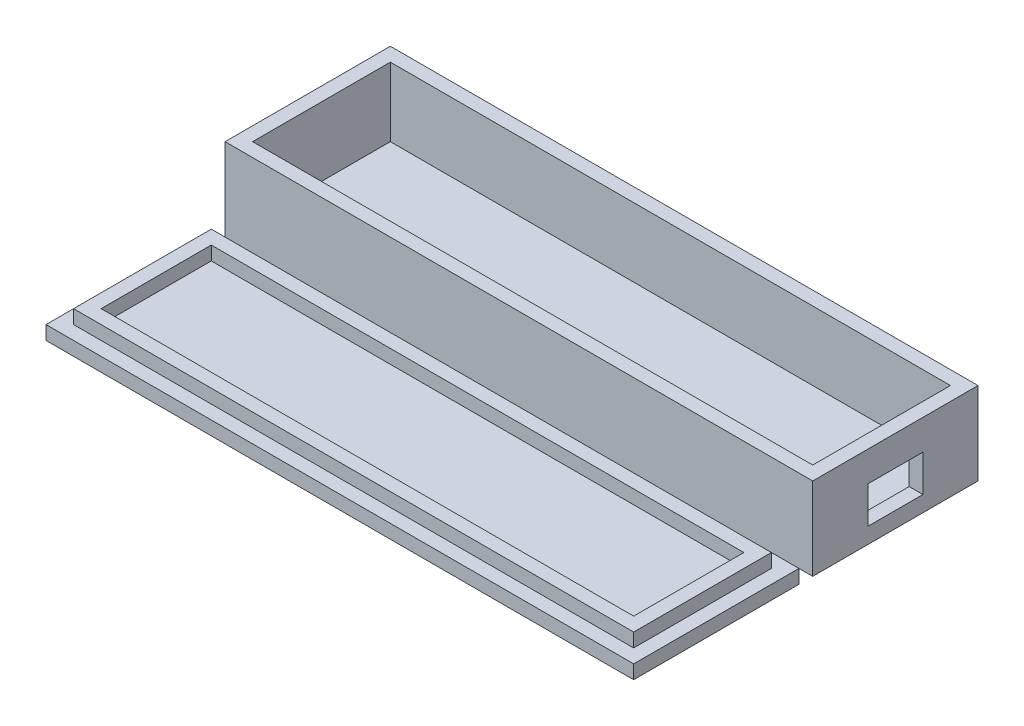
ISO-10303-21;
HEADER;
FILE_DESCRIPTION(('STEP AP214'),'2;1');
FILE_NAME('part.step','',(''),(''),'','','');
FILE_SCHEMA(('AUTOMOTIVE_DESIGN { 1 0 10303 214 1 1 1 1 }'));
ENDSEC;
DATA;
#1=APPLICATION_CONTEXT('core data for automotive mechanical design processes');
#2=APPLICATION_PROTOCOL_DEFINITION('international standard','automotive_design',2000,#1);
#3=PRODUCT_CONTEXT('',#1,'mechanical');
#4=PRODUCT('Part','Part','',(#3));
#5=PRODUCT_RELATED_PRODUCT_CATEGORY('part','',(#4));
#6=PRODUCT_DEFINITION_FORMATION('','',#4);
#7=PRODUCT_DEFINITION_CONTEXT('part definition',#1,'design');
#8=PRODUCT_DEFINITION('design','',#6,#7);
#9=PRODUCT_DEFINITION_SHAPE('','',#8);
#10=(LENGTH_UNIT() NAMED_UNIT(*) SI_UNIT(.MILLI.,.METRE.));
#11=(NAMED_UNIT(*) PLANE_ANGLE_UNIT() SI_UNIT($,.RADIAN.));
#12=(NAMED_UNIT(*) SI_UNIT($,.STERADIAN.) SOLID_ANGLE_UNIT());
#13=UNCERTAINTY_MEASURE_WITH_UNIT(LENGTH_MEASURE(1.E-05),#10,'distance_accuracy_value','');
#14=(GEOMETRIC_REPRESENTATION_CONTEXT(3) GLOBAL_UNCERTAINTY_ASSIGNED_CONTEXT((#13)) GLOBAL_UNIT_ASSIGNED_CONTEXT((#10,
#11,#12)) REPRESENTATION_CONTEXT('',''));
#15=CARTESIAN_POINT('',(0.,0.,0.));
#16=DIRECTION('',(0.,0.,1.));
#17=DIRECTION('',(1.,0.,0.));
#18=AXIS2_PLACEMENT_3D('',#15,#16,#17);
#19=CARTESIAN_POINT('',(0.,3.,0.));
#20=DIRECTION('',(0.,-1.,0.));
#21=DIRECTION('',(0.,0.,-1.));
#22=AXIS2_PLACEMENT_3D('',#19,#20,#21);
#23=PLANE('',#22);
#24=DIRECTION('',(0.,0.,-1.));
#25=VECTOR('',#24,1.);
#26=CARTESIAN_POINT('',(64.,3.,57.));
#27=LINE('',#26,#25);
#28=CARTESIAN_POINT('',(64.,3.,57.));
#29=VERTEX_POINT('',#28);
#30=CARTESIAN_POINT('',(64.,3.,21.));
#31=VERTEX_POINT('',#30);
#32=EDGE_CURVE('E167',#29,#31,#27,.T.);
#33=ORIENTED_EDGE('',*,*,#32,.T.);
#34=DIRECTION('',(-1.,0.,0.));
#35=VECTOR('',#34,1.);
#36=CARTESIAN_POINT('',(-64.,3.,21.));
#37=LINE('',#36,#35);
#38=CARTESIAN_POINT('',(-64.,3.,21.));
#39=VERTEX_POINT('',#38);
#40=EDGE_CURVE('E170',#31,#39,#37,.T.);
#41=ORIENTED_EDGE('',*,*,#40,.T.);
#42=DIRECTION('',(0.,0.,1.));
#43=VECTOR('',#42,1.);
#44=CARTESIAN_POINT('',(-64.,3.,57.));
#45=LINE('',#44,#43);
#46=CARTESIAN_POINT('',(-64.,3.,57.));
#47=VERTEX_POINT('',#46);
#48=EDGE_CURVE('E173',#39,#47,#45,.T.);
#49=ORIENTED_EDGE('',*,*,#48,.T.);
#50=DIRECTION('',(1.,0.,0.));
#51=VECTOR('',#50,1.);
#52=CARTESIAN_POINT('',(-64.,3.,57.));
#53=LINE('',#52,#51);
#54=EDGE_CURVE('E175',#47,#29,#53,.T.);
#55=ORIENTED_EDGE('',*,*,#54,.T.);
#56=EDGE_LOOP('',(#33,#41,#49,#55));
#57=FACE_BOUND('',#56,.T.);
#58=DIRECTION('',(1.,0.,0.));
#59=VECTOR('',#58,1.);
#60=CARTESIAN_POINT('',(0.,3.,54.));
#61=LINE('',#60,#59);
#62=CARTESIAN_POINT('',(-61.,3.,54.));
#63=VERTEX_POINT('',#62);
#64=CARTESIAN_POINT('',(61.,3.,54.));
#65=VERTEX_POINT('',#64);
#66=EDGE_CURVE('E157',#63,#65,#61,.T.);
#67=ORIENTED_EDGE('',*,*,#66,.F.);
#68=DIRECTION('',(0.,0.,-1.));
#69=VECTOR('',#68,1.);
#70=CARTESIAN_POINT('',(-61.,3.,0.));
#71=LINE('',#70,#69);
#72=CARTESIAN_POINT('',(-61.,3.,24.));
#73=VERTEX_POINT('',#72);
#74=EDGE_CURVE('E244',#63,#73,#71,.T.);
#75=ORIENTED_EDGE('',*,*,#74,.T.);
#76=DIRECTION('',(1.,0.,0.));
#77=VECTOR('',#76,1.);
#78=CARTESIAN_POINT('',(0.,3.,24.));
#79=LINE('',#78,#77);
#80=CARTESIAN_POINT('',(61.,3.,24.));
#81=VERTEX_POINT('',#80);
#82=EDGE_CURVE('E58',#73,#81,#79,.T.);
#83=ORIENTED_EDGE('',*,*,#82,.T.);
#84=DIRECTION('',(0.,0.,-1.));
#85=VECTOR('',#84,1.);
#86=CARTESIAN_POINT('',(61.,3.,0.));
#87=LINE('',#86,#85);
#88=EDGE_CURVE('E259',#65,#81,#87,.T.);
#89=ORIENTED_EDGE('',*,*,#88,.F.);
#90=EDGE_LOOP('',(#67,#75,#83,#89));
#91=FACE_BOUND('',#90,.T.);
#92=ADVANCED_FACE('F43',(#57,#91),#23,.F.);
#93=CARTESIAN_POINT('',(64.,3.,57.));
#94=DIRECTION('',(-1.,0.,0.));
#95=DIRECTION('',(0.,0.,1.));
#96=AXIS2_PLACEMENT_3D('',#93,#94,#95);
#97=PLANE('',#96);
#98=DIRECTION('',(0.,0.,-1.));
#99=VECTOR('',#98,1.);
#100=CARTESIAN_POINT('',(64.,0.,57.));
#101=LINE('',#100,#99);
#102=CARTESIAN_POINT('',(64.,0.,57.));
#103=VERTEX_POINT('',#102);
#104=CARTESIAN_POINT('',(64.,0.,21.));
#105=VERTEX_POINT('',#104);
#106=EDGE_CURVE('E178',#103,#105,#101,.T.);
#107=ORIENTED_EDGE('',*,*,#106,.T.);
#108=DIRECTION('',(0.,-1.,0.));
#109=VECTOR('',#108,1.);
#110=CARTESIAN_POINT('',(64.,3.,21.));
#111=LINE('',#110,#109);
#112=EDGE_CURVE('E12',#31,#105,#111,.T.);
#113=ORIENTED_EDGE('',*,*,#112,.F.);
#114=ORIENTED_EDGE('',*,*,#32,.F.);
#115=DIRECTION('',(0.,-1.,0.));
#116=VECTOR('',#115,1.);
#117=CARTESIAN_POINT('',(64.,3.,57.));
#118=LINE('',#117,#116);
#119=EDGE_CURVE('E177',#29,#103,#118,.T.);
#120=ORIENTED_EDGE('',*,*,#119,.T.);
#121=EDGE_LOOP('',(#107,#113,#114,#120));
#122=FACE_BOUND('',#121,.T.);
#123=ADVANCED_FACE('F45',(#122),#97,.F.);
#124=CARTESIAN_POINT('',(-64.,3.,21.));
#125=DIRECTION('',(0.,0.,1.));
#126=DIRECTION('',(1.,0.,0.));
#127=AXIS2_PLACEMENT_3D('',#124,#125,#126);
#128=PLANE('',#127);
#129=DIRECTION('',(-1.,0.,0.));
#130=VECTOR('',#129,1.);
#131=CARTESIAN_POINT('',(-64.,0.,21.));
#132=LINE('',#131,#130);
#133=CARTESIAN_POINT('',(-64.,0.,21.));
#134=VERTEX_POINT('',#133);
#135=EDGE_CURVE('E181',#105,#134,#132,.T.);
#136=ORIENTED_EDGE('',*,*,#135,.T.);
#137=DIRECTION('',(0.,-1.,0.));
#138=VECTOR('',#137,1.);
#139=CARTESIAN_POINT('',(-64.,3.,21.));
#140=LINE('',#139,#138);
#141=EDGE_CURVE('E51',#39,#134,#140,.T.);
#142=ORIENTED_EDGE('',*,*,#141,.F.);
#143=ORIENTED_EDGE('',*,*,#40,.F.);
#144=ORIENTED_EDGE('',*,*,#112,.T.);
#145=EDGE_LOOP('',(#136,#142,#143,#144));
#146=FACE_BOUND('',#145,.T.);
#147=ADVANCED_FACE('F212',(#146),#128,.F.);
#148=CARTESIAN_POINT('',(-64.,3.,57.));
#149=DIRECTION('',(1.,0.,0.));
#150=DIRECTION('',(0.,0.,-1.));
#151=AXIS2_PLACEMENT_3D('',#148,#149,#150);
#152=PLANE('',#151);
#153=DIRECTION('',(0.,0.,1.));
#154=VECTOR('',#153,1.);
#155=CARTESIAN_POINT('',(-64.,0.,57.));
#156=LINE('',#155,#154);
#157=CARTESIAN_POINT('',(-64.,0.,57.));
#158=VERTEX_POINT('',#157);
#159=EDGE_CURVE('E184',#134,#158,#156,.T.);
#160=ORIENTED_EDGE('',*,*,#159,.T.);
#161=DIRECTION('',(0.,-1.,0.));
#162=VECTOR('',#161,1.);
#163=CARTESIAN_POINT('',(-64.,3.,57.));
#164=LINE('',#163,#162);
#165=EDGE_CURVE('E189',#47,#158,#164,.T.);
#166=ORIENTED_EDGE('',*,*,#165,.F.);
#167=ORIENTED_EDGE('',*,*,#48,.F.);
#168=ORIENTED_EDGE('',*,*,#141,.T.);
#169=EDGE_LOOP('',(#160,#166,#167,#168));
#170=FACE_BOUND('',#169,.T.);
#171=ADVANCED_FACE('F196',(#170),#152,.F.);
#172=CARTESIAN_POINT('',(-64.,3.,57.));
#173=DIRECTION('',(0.,0.,-1.));
#174=DIRECTION('',(-1.,0.,0.));
#175=AXIS2_PLACEMENT_3D('',#172,#173,#174);
#176=PLANE('',#175);
#177=DIRECTION('',(1.,0.,0.));
#178=VECTOR('',#177,1.);
#179=CARTESIAN_POINT('',(-64.,0.,57.));
#180=LINE('',#179,#178);
#181=EDGE_CURVE('E171',#158,#103,#180,.T.);
#182=ORIENTED_EDGE('',*,*,#181,.T.);
#183=ORIENTED_EDGE('',*,*,#119,.F.);
#184=ORIENTED_EDGE('',*,*,#54,.F.);
#185=ORIENTED_EDGE('',*,*,#165,.T.);
#186=EDGE_LOOP('',(#182,#183,#184,#185));
#187=FACE_BOUND('',#186,.T.);
#188=ADVANCED_FACE('F205',(#187),#176,.F.);
#189=CARTESIAN_POINT('',(0.,0.,0.));
#190=DIRECTION('',(0.,-1.,0.));
#191=DIRECTION('',(0.,0.,-1.));
#192=AXIS2_PLACEMENT_3D('',#189,#190,#191);
#193=PLANE('',#192);
#194=ORIENTED_EDGE('',*,*,#106,.F.);
#195=ORIENTED_EDGE('',*,*,#181,.F.);
#196=ORIENTED_EDGE('',*,*,#159,.F.);
#197=ORIENTED_EDGE('',*,*,#135,.F.);
#198=EDGE_LOOP('',(#194,#195,#196,#197));
#199=FACE_BOUND('',#198,.T.);
#200=ADVANCED_FACE('F202',(#199),#193,.T.);
#201=CARTESIAN_POINT('',(0.,6.,51.));
#202=DIRECTION('',(0.,0.,-1.));
#203=DIRECTION('',(-1.,0.,0.));
#204=AXIS2_PLACEMENT_3D('',#201,#202,#203);
#205=PLANE('',#204);
#206=DIRECTION('',(1.,0.,0.));
#207=VECTOR('',#206,1.);
#208=CARTESIAN_POINT('',(0.,3.,51.));
#209=LINE('',#208,#207);
#210=CARTESIAN_POINT('',(-58.,3.,51.));
#211=VERTEX_POINT('',#210);
#212=CARTESIAN_POINT('',(58.,3.,51.));
#213=VERTEX_POINT('',#212);
#214=EDGE_CURVE('E239',#211,#213,#209,.T.);
#215=ORIENTED_EDGE('',*,*,#214,.F.);
#216=DIRECTION('',(0.,-1.,0.));
#217=VECTOR('',#216,1.);
#218=CARTESIAN_POINT('',(-58.,6.,51.));
#219=LINE('',#218,#217);
#220=CARTESIAN_POINT('',(-58.,6.,51.));
#221=VERTEX_POINT('',#220);
#222=EDGE_CURVE('E182',#221,#211,#219,.T.);
#223=ORIENTED_EDGE('',*,*,#222,.F.);
#224=DIRECTION('',(1.,0.,0.));
#225=VECTOR('',#224,1.);
#226=CARTESIAN_POINT('',(0.,6.,51.));
#227=LINE('',#226,#225);
#228=CARTESIAN_POINT('',(58.,6.,51.));
#229=VERTEX_POINT('',#228);
#230=EDGE_CURVE('E271',#221,#229,#227,.T.);
#231=ORIENTED_EDGE('',*,*,#230,.T.);
#232=DIRECTION('',(0.,-1.,0.));
#233=VECTOR('',#232,1.);
#234=CARTESIAN_POINT('',(58.,6.,51.));
#235=LINE('',#234,#233);
#236=EDGE_CURVE('E159',#229,#213,#235,.T.);
#237=ORIENTED_EDGE('',*,*,#236,.T.);
#238=EDGE_LOOP('',(#215,#223,#231,#237));
#239=FACE_BOUND('',#238,.T.);
#240=ADVANCED_FACE('F295',(#239),#205,.T.);
#241=CARTESIAN_POINT('',(-58.,6.,0.));
#242=DIRECTION('',(-1.,0.,0.));
#243=DIRECTION('',(0.,0.,1.));
#244=AXIS2_PLACEMENT_3D('',#241,#242,#243);
#245=PLANE('',#244);
#246=DIRECTION('',(0.,0.,-1.));
#247=VECTOR('',#246,1.);
#248=CARTESIAN_POINT('',(-58.,3.,0.));
#249=LINE('',#248,#247);
#250=CARTESIAN_POINT('',(-58.,3.,27.));
#251=VERTEX_POINT('',#250);
#252=EDGE_CURVE('E236',#211,#251,#249,.T.);
#253=ORIENTED_EDGE('',*,*,#252,.T.);
#254=DIRECTION('',(0.,-1.,0.));
#255=VECTOR('',#254,1.);
#256=CARTESIAN_POINT('',(-58.,6.,27.));
#257=LINE('',#256,#255);
#258=CARTESIAN_POINT('',(-58.,6.,27.));
#259=VERTEX_POINT('',#258);
#260=EDGE_CURVE('E250',#259,#251,#257,.T.);
#261=ORIENTED_EDGE('',*,*,#260,.F.);
#262=DIRECTION('',(0.,0.,-1.));
#263=VECTOR('',#262,1.);
#264=CARTESIAN_POINT('',(-58.,6.,0.));
#265=LINE('',#264,#263);
#266=EDGE_CURVE('E268',#221,#259,#265,.T.);
#267=ORIENTED_EDGE('',*,*,#266,.F.);
#268=ORIENTED_EDGE('',*,*,#222,.T.);
#269=EDGE_LOOP('',(#253,#261,#267,#268));
#270=FACE_BOUND('',#269,.T.);
#271=ADVANCED_FACE('F290',(#270),#245,.F.);
#272=CARTESIAN_POINT('',(0.,6.,27.));
#273=DIRECTION('',(0.,0.,-1.));
#274=DIRECTION('',(-1.,0.,0.));
#275=AXIS2_PLACEMENT_3D('',#272,#273,#274);
#276=PLANE('',#275);
#277=DIRECTION('',(1.,0.,0.));
#278=VECTOR('',#277,1.);
#279=CARTESIAN_POINT('',(0.,3.,27.));
#280=LINE('',#279,#278);
#281=CARTESIAN_POINT('',(58.,3.,27.));
#282=VERTEX_POINT('',#281);
#283=EDGE_CURVE('E66',#251,#282,#280,.T.);
#284=ORIENTED_EDGE('',*,*,#283,.T.);
#285=DIRECTION('',(0.,-1.,0.));
#286=VECTOR('',#285,1.);
#287=CARTESIAN_POINT('',(58.,6.,27.));
#288=LINE('',#287,#286);
#289=CARTESIAN_POINT('',(58.,6.,27.));
#290=VERTEX_POINT('',#289);
#291=EDGE_CURVE('E161',#290,#282,#288,.T.);
#292=ORIENTED_EDGE('',*,*,#291,.F.);
#293=DIRECTION('',(1.,0.,0.));
#294=VECTOR('',#293,1.);
#295=CARTESIAN_POINT('',(0.,6.,27.));
#296=LINE('',#295,#294);
#297=EDGE_CURVE('E266',#259,#290,#296,.T.);
#298=ORIENTED_EDGE('',*,*,#297,.F.);
#299=ORIENTED_EDGE('',*,*,#260,.T.);
#300=EDGE_LOOP('',(#284,#292,#298,#299));
#301=FACE_BOUND('',#300,.T.);
#302=ADVANCED_FACE('F286',(#301),#276,.F.);
#303=CARTESIAN_POINT('',(0.,6.,54.));
#304=DIRECTION('',(0.,0.,-1.));
#305=DIRECTION('',(-1.,0.,0.));
#306=AXIS2_PLACEMENT_3D('',#303,#304,#305);
#307=PLANE('',#306);
#308=ORIENTED_EDGE('',*,*,#66,.T.);
#309=DIRECTION('',(0.,-1.,0.));
#310=VECTOR('',#309,1.);
#311=CARTESIAN_POINT('',(61.,6.,54.));
#312=LINE('',#311,#310);
#313=CARTESIAN_POINT('',(61.,6.,54.));
#314=VERTEX_POINT('',#313);
#315=EDGE_CURVE('E137',#314,#65,#312,.T.);
#316=ORIENTED_EDGE('',*,*,#315,.F.);
#317=DIRECTION('',(1.,0.,0.));
#318=VECTOR('',#317,1.);
#319=CARTESIAN_POINT('',(0.,6.,54.));
#320=LINE('',#319,#318);
#321=CARTESIAN_POINT('',(-61.,6.,54.));
#322=VERTEX_POINT('',#321);
#323=EDGE_CURVE('E144',#322,#314,#320,.T.);
#324=ORIENTED_EDGE('',*,*,#323,.F.);
#325=DIRECTION('',(0.,-1.,0.));
#326=VECTOR('',#325,1.);
#327=CARTESIAN_POINT('',(-61.,6.,54.));
#328=LINE('',#327,#326);
#329=EDGE_CURVE('E253',#322,#63,#328,.T.);
#330=ORIENTED_EDGE('',*,*,#329,.T.);
#331=EDGE_LOOP('',(#308,#316,#324,#330));
#332=FACE_BOUND('',#331,.T.);
#333=ADVANCED_FACE('F155',(#332),#307,.F.);
#334=CARTESIAN_POINT('',(61.,6.,0.));
#335=DIRECTION('',(-1.,0.,0.));
#336=DIRECTION('',(0.,0.,1.));
#337=AXIS2_PLACEMENT_3D('',#334,#335,#336);
#338=PLANE('',#337);
#339=ORIENTED_EDGE('',*,*,#88,.T.);
#340=DIRECTION('',(0.,-1.,0.));
#341=VECTOR('',#340,1.);
#342=CARTESIAN_POINT('',(61.,6.,24.));
#343=LINE('',#342,#341);
#344=CARTESIAN_POINT('',(61.,6.,24.));
#345=VERTEX_POINT('',#344);
#346=EDGE_CURVE('E139',#345,#81,#343,.T.);
#347=ORIENTED_EDGE('',*,*,#346,.F.);
#348=DIRECTION('',(0.,0.,-1.));
#349=VECTOR('',#348,1.);
#350=CARTESIAN_POINT('',(61.,6.,0.));
#351=LINE('',#350,#349);
#352=EDGE_CURVE('E132',#314,#345,#351,.T.);
#353=ORIENTED_EDGE('',*,*,#352,.F.);
#354=ORIENTED_EDGE('',*,*,#315,.T.);
#355=EDGE_LOOP('',(#339,#347,#353,#354));
#356=FACE_BOUND('',#355,.T.);
#357=ADVANCED_FACE('F135',(#356),#338,.F.);
#358=CARTESIAN_POINT('',(0.,6.,24.));
#359=DIRECTION('',(0.,0.,-1.));
#360=DIRECTION('',(-1.,0.,0.));
#361=AXIS2_PLACEMENT_3D('',#358,#359,#360);
#362=PLANE('',#361);
#363=ORIENTED_EDGE('',*,*,#82,.F.);
#364=DIRECTION('',(0.,-1.,0.));
#365=VECTOR('',#364,1.);
#366=CARTESIAN_POINT('',(-61.,6.,24.));
#367=LINE('',#366,#365);
#368=CARTESIAN_POINT('',(-61.,6.,24.));
#369=VERTEX_POINT('',#368);
#370=EDGE_CURVE('E163',#369,#73,#367,.T.);
#371=ORIENTED_EDGE('',*,*,#370,.F.);
#372=DIRECTION('',(1.,0.,0.));
#373=VECTOR('',#372,1.);
#374=CARTESIAN_POINT('',(0.,6.,24.));
#375=LINE('',#374,#373);
#376=EDGE_CURVE('E143',#369,#345,#375,.T.);
#377=ORIENTED_EDGE('',*,*,#376,.T.);
#378=ORIENTED_EDGE('',*,*,#346,.T.);
#379=EDGE_LOOP('',(#363,#371,#377,#378));
#380=FACE_BOUND('',#379,.T.);
#381=ADVANCED_FACE('F275',(#380),#362,.T.);
#382=CARTESIAN_POINT('',(-61.,6.,0.));
#383=DIRECTION('',(-1.,0.,0.));
#384=DIRECTION('',(0.,0.,1.));
#385=AXIS2_PLACEMENT_3D('',#382,#383,#384);
#386=PLANE('',#385);
#387=ORIENTED_EDGE('',*,*,#74,.F.);
#388=ORIENTED_EDGE('',*,*,#329,.F.);
#389=DIRECTION('',(0.,0.,-1.));
#390=VECTOR('',#389,1.);
#391=CARTESIAN_POINT('',(-61.,6.,0.));
#392=LINE('',#391,#390);
#393=EDGE_CURVE('E151',#322,#369,#392,.T.);
#394=ORIENTED_EDGE('',*,*,#393,.T.);
#395=ORIENTED_EDGE('',*,*,#370,.T.);
#396=EDGE_LOOP('',(#387,#388,#394,#395));
#397=FACE_BOUND('',#396,.T.);
#398=ADVANCED_FACE('F258',(#397),#386,.T.);
#399=CARTESIAN_POINT('',(58.,6.,0.));
#400=DIRECTION('',(-1.,0.,0.));
#401=DIRECTION('',(0.,0.,1.));
#402=AXIS2_PLACEMENT_3D('',#399,#400,#401);
#403=PLANE('',#402);
#404=DIRECTION('',(0.,0.,-1.));
#405=VECTOR('',#404,1.);
#406=CARTESIAN_POINT('',(58.,3.,0.));
#407=LINE('',#406,#405);
#408=EDGE_CURVE('E153',#213,#282,#407,.T.);
#409=ORIENTED_EDGE('',*,*,#408,.F.);
#410=ORIENTED_EDGE('',*,*,#236,.F.);
#411=DIRECTION('',(0.,0.,-1.));
#412=VECTOR('',#411,1.);
#413=CARTESIAN_POINT('',(58.,6.,0.));
#414=LINE('',#413,#412);
#415=EDGE_CURVE('E254',#229,#290,#414,.T.);
#416=ORIENTED_EDGE('',*,*,#415,.T.);
#417=ORIENTED_EDGE('',*,*,#291,.T.);
#418=EDGE_LOOP('',(#409,#410,#416,#417));
#419=FACE_BOUND('',#418,.T.);
#420=ADVANCED_FACE('F231',(#419),#403,.T.);
#421=CARTESIAN_POINT('',(0.,6.,0.));
#422=DIRECTION('',(0.,1.,0.));
#423=DIRECTION('',(0.,0.,1.));
#424=AXIS2_PLACEMENT_3D('',#421,#422,#423);
#425=PLANE('',#424);
#426=ORIENTED_EDGE('',*,*,#323,.T.);
#427=ORIENTED_EDGE('',*,*,#352,.T.);
#428=ORIENTED_EDGE('',*,*,#376,.F.);
#429=ORIENTED_EDGE('',*,*,#393,.F.);
#430=EDGE_LOOP('',(#426,#427,#428,#429));
#431=FACE_BOUND('',#430,.T.);
#432=ORIENTED_EDGE('',*,*,#230,.F.);
#433=ORIENTED_EDGE('',*,*,#266,.T.);
#434=ORIENTED_EDGE('',*,*,#297,.T.);
#435=ORIENTED_EDGE('',*,*,#415,.F.);
#436=EDGE_LOOP('',(#432,#433,#434,#435));
#437=FACE_BOUND('',#436,.T.);
#438=ADVANCED_FACE('F148',(#431,#437),#425,.T.);
#439=ORIENTED_EDGE('',*,*,#252,.F.);
#440=ORIENTED_EDGE('',*,*,#214,.T.);
#441=ORIENTED_EDGE('',*,*,#408,.T.);
#442=ORIENTED_EDGE('',*,*,#283,.F.);
#443=EDGE_LOOP('',(#439,#440,#441,#442));
#444=FACE_BOUND('',#443,.T.);
#445=ADVANCED_FACE('F221',(#444),#23,.F.);
#446=CLOSED_SHELL('',(#92,#123,#147,#171,#188,#200,#240,#271,#302,#333,#357,#381,#398,#420,#438,#445));
#447=MANIFOLD_SOLID_BREP('B2',#446);
#448=CARTESIAN_POINT('',(64.,3.,18.));
#449=DIRECTION('',(-1.,0.,0.));
#450=DIRECTION('',(0.,0.,1.));
#451=AXIS2_PLACEMENT_3D('',#448,#449,#450);
#452=PLANE('',#451);
#453=DIRECTION('',(0.,0.,1.));
#454=VECTOR('',#453,1.);
#455=CARTESIAN_POINT('',(64.,11.4383547284987,6.));
#456=LINE('',#455,#454);
#457=CARTESIAN_POINT('',(64.,11.4383547284987,-6.));
#458=VERTEX_POINT('',#457);
#459=CARTESIAN_POINT('',(64.,11.4383547284987,6.));
#460=VERTEX_POINT('',#459);
#461=EDGE_CURVE('E495',#458,#460,#456,.T.);
#462=ORIENTED_EDGE('',*,*,#461,.F.);
#463=DIRECTION('',(0.,1.,0.));
#464=VECTOR('',#463,1.);
#465=CARTESIAN_POINT('',(64.,3.43835472849873,-6.));
#466=LINE('',#465,#464);
#467=CARTESIAN_POINT('',(64.,3.43835472849873,-6.));
#468=VERTEX_POINT('',#467);
#469=EDGE_CURVE('E410',#468,#458,#466,.T.);
#470=ORIENTED_EDGE('',*,*,#469,.F.);
#471=DIRECTION('',(0.,0.,-1.));
#472=VECTOR('',#471,1.);
#473=CARTESIAN_POINT('',(64.,3.43835472849873,6.));
#474=LINE('',#473,#472);
#475=CARTESIAN_POINT('',(64.,3.43835472849873,6.));
#476=VERTEX_POINT('',#475);
#477=EDGE_CURVE('E501',#476,#468,#474,.T.);
#478=ORIENTED_EDGE('',*,*,#477,.F.);
#479=DIRECTION('',(0.,-1.,0.));
#480=VECTOR('',#479,1.);
#481=CARTESIAN_POINT('',(64.,3.43835472849873,6.));
#482=LINE('',#481,#480);
#483=EDGE_CURVE('E486',#460,#476,#482,.T.);
#484=ORIENTED_EDGE('',*,*,#483,.F.);
#485=EDGE_LOOP('',(#462,#470,#478,#484));
#486=FACE_BOUND('',#485,.T.);
#487=DIRECTION('',(0.,0.,-1.));
#488=VECTOR('',#487,1.);
#489=CARTESIAN_POINT('',(64.,0.,18.));
#490=LINE('',#489,#488);
#491=CARTESIAN_POINT('',(64.,0.,18.));
#492=VERTEX_POINT('',#491);
#493=CARTESIAN_POINT('',(64.,0.,-18.));
#494=VERTEX_POINT('',#493);
#495=EDGE_CURVE('E552',#492,#494,#490,.T.);
#496=ORIENTED_EDGE('',*,*,#495,.T.);
#497=DIRECTION('',(0.,-1.,0.));
#498=VECTOR('',#497,1.);
#499=CARTESIAN_POINT('',(64.,3.,-18.));
#500=LINE('',#499,#498);
#501=CARTESIAN_POINT('',(64.,18.,-18.));
#502=VERTEX_POINT('',#501);
#503=EDGE_CURVE('E570',#502,#494,#500,.T.);
#504=ORIENTED_EDGE('',*,*,#503,.F.);
#505=DIRECTION('',(0.,0.,-1.));
#506=VECTOR('',#505,1.);
#507=CARTESIAN_POINT('',(64.,18.,18.));
#508=LINE('',#507,#506);
#509=CARTESIAN_POINT('',(64.,18.,18.));
#510=VERTEX_POINT('',#509);
#511=EDGE_CURVE('E540',#510,#502,#508,.T.);
#512=ORIENTED_EDGE('',*,*,#511,.F.);
#513=DIRECTION('',(0.,-1.,0.));
#514=VECTOR('',#513,1.);
#515=CARTESIAN_POINT('',(64.,3.,18.));
#516=LINE('',#515,#514);
#517=EDGE_CURVE('E561',#510,#492,#516,.T.);
#518=ORIENTED_EDGE('',*,*,#517,.T.);
#519=EDGE_LOOP('',(#496,#504,#512,#518));
#520=FACE_BOUND('',#519,.T.);
#521=ADVANCED_FACE('F396',(#486,#520),#452,.F.);
#522=CARTESIAN_POINT('',(-64.,3.,-18.));
#523=DIRECTION('',(0.,0.,1.));
#524=DIRECTION('',(1.,0.,0.));
#525=AXIS2_PLACEMENT_3D('',#522,#523,#524);
#526=PLANE('',#525);
#527=DIRECTION('',(-1.,0.,0.));
#528=VECTOR('',#527,1.);
#529=CARTESIAN_POINT('',(-64.,0.,-18.));
#530=LINE('',#529,#528);
#531=CARTESIAN_POINT('',(-64.,0.,-18.));
#532=VERTEX_POINT('',#531);
#533=EDGE_CURVE('E555',#494,#532,#530,.T.);
#534=ORIENTED_EDGE('',*,*,#533,.T.);
#535=DIRECTION('',(0.,-1.,0.));
#536=VECTOR('',#535,1.);
#537=CARTESIAN_POINT('',(-64.,3.,-18.));
#538=LINE('',#537,#536);
#539=CARTESIAN_POINT('',(-64.,18.,-18.));
#540=VERTEX_POINT('',#539);
#541=EDGE_CURVE('E567',#540,#532,#538,.T.);
#542=ORIENTED_EDGE('',*,*,#541,.F.);
#543=DIRECTION('',(-1.,0.,0.));
#544=VECTOR('',#543,1.);
#545=CARTESIAN_POINT('',(-64.,18.,-18.));
#546=LINE('',#545,#544);
#547=EDGE_CURVE('E543',#502,#540,#546,.T.);
#548=ORIENTED_EDGE('',*,*,#547,.F.);
#549=ORIENTED_EDGE('',*,*,#503,.T.);
#550=EDGE_LOOP('',(#534,#542,#548,#549));
#551=FACE_BOUND('',#550,.T.);
#552=ADVANCED_FACE('F598',(#551),#526,.F.);
#553=CARTESIAN_POINT('',(-64.,3.,18.));
#554=DIRECTION('',(1.,0.,0.));
#555=DIRECTION('',(0.,0.,-1.));
#556=AXIS2_PLACEMENT_3D('',#553,#554,#555);
#557=PLANE('',#556);
#558=DIRECTION('',(0.,0.,1.));
#559=VECTOR('',#558,1.);
#560=CARTESIAN_POINT('',(-64.,0.,18.));
#561=LINE('',#560,#559);
#562=CARTESIAN_POINT('',(-64.,0.,18.));
#563=VERTEX_POINT('',#562);
#564=EDGE_CURVE('E557',#532,#563,#561,.T.);
#565=ORIENTED_EDGE('',*,*,#564,.T.);
#566=DIRECTION('',(0.,-1.,0.));
#567=VECTOR('',#566,1.);
#568=CARTESIAN_POINT('',(-64.,3.,18.));
#569=LINE('',#568,#567);
#570=CARTESIAN_POINT('',(-64.,18.,18.));
#571=VERTEX_POINT('',#570);
#572=EDGE_CURVE('E564',#571,#563,#569,.T.);
#573=ORIENTED_EDGE('',*,*,#572,.F.);
#574=DIRECTION('',(0.,0.,1.));
#575=VECTOR('',#574,1.);
#576=CARTESIAN_POINT('',(-64.,18.,18.));
#577=LINE('',#576,#575);
#578=EDGE_CURVE('E546',#540,#571,#577,.T.);
#579=ORIENTED_EDGE('',*,*,#578,.F.);
#580=ORIENTED_EDGE('',*,*,#541,.T.);
#581=EDGE_LOOP('',(#565,#573,#579,#580));
#582=FACE_BOUND('',#581,.T.);
#583=ADVANCED_FACE('F602',(#582),#557,.F.);
#584=CARTESIAN_POINT('',(-64.,3.,18.));
#585=DIRECTION('',(0.,0.,-1.));
#586=DIRECTION('',(-1.,0.,0.));
#587=AXIS2_PLACEMENT_3D('',#584,#585,#586);
#588=PLANE('',#587);
#589=DIRECTION('',(1.,0.,0.));
#590=VECTOR('',#589,1.);
#591=CARTESIAN_POINT('',(-64.,0.,18.));
#592=LINE('',#591,#590);
#593=EDGE_CURVE('E559',#563,#492,#592,.T.);
#594=ORIENTED_EDGE('',*,*,#593,.T.);
#595=ORIENTED_EDGE('',*,*,#517,.F.);
#596=DIRECTION('',(1.,0.,0.));
#597=VECTOR('',#596,1.);
#598=CARTESIAN_POINT('',(-64.,18.,18.));
#599=LINE('',#598,#597);
#600=EDGE_CURVE('E549',#571,#510,#599,.T.);
#601=ORIENTED_EDGE('',*,*,#600,.F.);
#602=ORIENTED_EDGE('',*,*,#572,.T.);
#603=EDGE_LOOP('',(#594,#595,#601,#602));
#604=FACE_BOUND('',#603,.T.);
#605=ADVANCED_FACE('F607',(#604),#588,.F.);
#606=CARTESIAN_POINT('',(0.,0.,0.));
#607=DIRECTION('',(0.,-1.,0.));
#608=DIRECTION('',(0.,0.,-1.));
#609=AXIS2_PLACEMENT_3D('',#606,#607,#608);
#610=PLANE('',#609);
#611=ORIENTED_EDGE('',*,*,#495,.F.);
#612=ORIENTED_EDGE('',*,*,#593,.F.);
#613=ORIENTED_EDGE('',*,*,#564,.F.);
#614=ORIENTED_EDGE('',*,*,#533,.F.);
#615=EDGE_LOOP('',(#611,#612,#613,#614));
#616=FACE_BOUND('',#615,.T.);
#617=ADVANCED_FACE('F613',(#616),#610,.T.);
#618=CARTESIAN_POINT('',(0.,18.,0.));
#619=DIRECTION('',(0.,-1.,0.));
#620=DIRECTION('',(0.,0.,-1.));
#621=AXIS2_PLACEMENT_3D('',#618,#619,#620);
#622=PLANE('',#621);
#623=ORIENTED_EDGE('',*,*,#511,.T.);
#624=ORIENTED_EDGE('',*,*,#547,.T.);
#625=ORIENTED_EDGE('',*,*,#578,.T.);
#626=ORIENTED_EDGE('',*,*,#600,.T.);
#627=EDGE_LOOP('',(#623,#624,#625,#626));
#628=FACE_BOUND('',#627,.T.);
#629=DIRECTION('',(0.,0.,-1.));
#630=VECTOR('',#629,1.);
#631=CARTESIAN_POINT('',(61.,18.,15.));
#632=LINE('',#631,#630);
#633=CARTESIAN_POINT('',(61.,18.,15.));
#634=VERTEX_POINT('',#633);
#635=CARTESIAN_POINT('',(61.,18.,-15.));
#636=VERTEX_POINT('',#635);
#637=EDGE_CURVE('E511',#634,#636,#632,.T.);
#638=ORIENTED_EDGE('',*,*,#637,.F.);
#639=DIRECTION('',(1.,0.,0.));
#640=VECTOR('',#639,1.);
#641=CARTESIAN_POINT('',(-61.,18.,15.));
#642=LINE('',#641,#640);
#643=CARTESIAN_POINT('',(-61.,18.,15.));
#644=VERTEX_POINT('',#643);
#645=EDGE_CURVE('E519',#644,#634,#642,.T.);
#646=ORIENTED_EDGE('',*,*,#645,.F.);
#647=DIRECTION('',(0.,0.,1.));
#648=VECTOR('',#647,1.);
#649=CARTESIAN_POINT('',(-61.,18.,15.));
#650=LINE('',#649,#648);
#651=CARTESIAN_POINT('',(-61.,18.,-15.));
#652=VERTEX_POINT('',#651);
#653=EDGE_CURVE('E516',#652,#644,#650,.T.);
#654=ORIENTED_EDGE('',*,*,#653,.F.);
#655=DIRECTION('',(-1.,0.,0.));
#656=VECTOR('',#655,1.);
#657=CARTESIAN_POINT('',(-61.,18.,-15.));
#658=LINE('',#657,#656);
#659=EDGE_CURVE('E513',#636,#652,#658,.T.);
#660=ORIENTED_EDGE('',*,*,#659,.F.);
#661=EDGE_LOOP('',(#638,#646,#654,#660));
#662=FACE_BOUND('',#661,.T.);
#663=ADVANCED_FACE('F616',(#628,#662),#622,.F.);
#664=CARTESIAN_POINT('',(61.,18.,15.));
#665=DIRECTION('',(-1.,0.,0.));
#666=DIRECTION('',(0.,0.,1.));
#667=AXIS2_PLACEMENT_3D('',#664,#665,#666);
#668=PLANE('',#667);
#669=DIRECTION('',(0.,-1.,0.));
#670=VECTOR('',#669,1.);
#671=CARTESIAN_POINT('',(61.,18.,-6.));
#672=LINE('',#671,#670);
#673=CARTESIAN_POINT('',(61.,11.4383547284987,-6.));
#674=VERTEX_POINT('',#673);
#675=CARTESIAN_POINT('',(61.,3.43835472849873,-6.));
#676=VERTEX_POINT('',#675);
#677=EDGE_CURVE('E41',#674,#676,#672,.T.);
#678=ORIENTED_EDGE('',*,*,#677,.F.);
#679=DIRECTION('',(0.,0.,-1.));
#680=VECTOR('',#679,1.);
#681=CARTESIAN_POINT('',(61.,11.4383547284987,15.));
#682=LINE('',#681,#680);
#683=CARTESIAN_POINT('',(61.,11.4383547284987,6.));
#684=VERTEX_POINT('',#683);
#685=EDGE_CURVE('E573',#684,#674,#682,.T.);
#686=ORIENTED_EDGE('',*,*,#685,.F.);
#687=DIRECTION('',(0.,1.,0.));
#688=VECTOR('',#687,1.);
#689=CARTESIAN_POINT('',(61.,18.,6.));
#690=LINE('',#689,#688);
#691=CARTESIAN_POINT('',(61.,3.43835472849873,6.));
#692=VERTEX_POINT('',#691);
#693=EDGE_CURVE('E489',#692,#684,#690,.T.);
#694=ORIENTED_EDGE('',*,*,#693,.F.);
#695=DIRECTION('',(0.,0.,1.));
#696=VECTOR('',#695,1.);
#697=CARTESIAN_POINT('',(61.,3.43835472849873,15.));
#698=LINE('',#697,#696);
#699=EDGE_CURVE('E403',#676,#692,#698,.T.);
#700=ORIENTED_EDGE('',*,*,#699,.F.);
#701=EDGE_LOOP('',(#678,#686,#694,#700));
#702=FACE_BOUND('',#701,.T.);
#703=DIRECTION('',(0.,0.,-1.));
#704=VECTOR('',#703,1.);
#705=CARTESIAN_POINT('',(61.,3.,15.));
#706=LINE('',#705,#704);
#707=CARTESIAN_POINT('',(61.,3.,15.));
#708=VERTEX_POINT('',#707);
#709=CARTESIAN_POINT('',(61.,3.,-15.));
#710=VERTEX_POINT('',#709);
#711=EDGE_CURVE('E508',#708,#710,#706,.T.);
#712=ORIENTED_EDGE('',*,*,#711,.F.);
#713=DIRECTION('',(0.,-1.,0.));
#714=VECTOR('',#713,1.);
#715=CARTESIAN_POINT('',(61.,18.,15.));
#716=LINE('',#715,#714);
#717=EDGE_CURVE('E521',#634,#708,#716,.T.);
#718=ORIENTED_EDGE('',*,*,#717,.F.);
#719=ORIENTED_EDGE('',*,*,#637,.T.);
#720=DIRECTION('',(0.,-1.,0.));
#721=VECTOR('',#720,1.);
#722=CARTESIAN_POINT('',(61.,18.,-15.));
#723=LINE('',#722,#721);
#724=EDGE_CURVE('E537',#636,#710,#723,.T.);
#725=ORIENTED_EDGE('',*,*,#724,.T.);
#726=EDGE_LOOP('',(#712,#718,#719,#725));
#727=FACE_BOUND('',#726,.T.);
#728=ADVANCED_FACE('F581',(#702,#727),#668,.T.);
#729=CARTESIAN_POINT('',(-61.,18.,-15.));
#730=DIRECTION('',(0.,0.,1.));
#731=DIRECTION('',(1.,0.,0.));
#732=AXIS2_PLACEMENT_3D('',#729,#730,#731);
#733=PLANE('',#732);
#734=DIRECTION('',(-1.,0.,0.));
#735=VECTOR('',#734,1.);
#736=CARTESIAN_POINT('',(-61.,3.,-15.));
#737=LINE('',#736,#735);
#738=CARTESIAN_POINT('',(-61.,3.,-15.));
#739=VERTEX_POINT('',#738);
#740=EDGE_CURVE('E524',#710,#739,#737,.T.);
#741=ORIENTED_EDGE('',*,*,#740,.F.);
#742=ORIENTED_EDGE('',*,*,#724,.F.);
#743=ORIENTED_EDGE('',*,*,#659,.T.);
#744=DIRECTION('',(0.,-1.,0.));
#745=VECTOR('',#744,1.);
#746=CARTESIAN_POINT('',(-61.,18.,-15.));
#747=LINE('',#746,#745);
#748=EDGE_CURVE('E535',#652,#739,#747,.T.);
#749=ORIENTED_EDGE('',*,*,#748,.T.);
#750=EDGE_LOOP('',(#741,#742,#743,#749));
#751=FACE_BOUND('',#750,.T.);
#752=ADVANCED_FACE('F624',(#751),#733,.T.);
#753=CARTESIAN_POINT('',(-61.,18.,15.));
#754=DIRECTION('',(1.,0.,0.));
#755=DIRECTION('',(0.,0.,-1.));
#756=AXIS2_PLACEMENT_3D('',#753,#754,#755);
#757=PLANE('',#756);
#758=DIRECTION('',(0.,0.,1.));
#759=VECTOR('',#758,1.);
#760=CARTESIAN_POINT('',(-61.,3.,15.));
#761=LINE('',#760,#759);
#762=CARTESIAN_POINT('',(-61.,3.,15.));
#763=VERTEX_POINT('',#762);
#764=EDGE_CURVE('E527',#739,#763,#761,.T.);
#765=ORIENTED_EDGE('',*,*,#764,.F.);
#766=ORIENTED_EDGE('',*,*,#748,.F.);
#767=ORIENTED_EDGE('',*,*,#653,.T.);
#768=DIRECTION('',(0.,-1.,0.));
#769=VECTOR('',#768,1.);
#770=CARTESIAN_POINT('',(-61.,18.,15.));
#771=LINE('',#770,#769);
#772=EDGE_CURVE('E533',#644,#763,#771,.T.);
#773=ORIENTED_EDGE('',*,*,#772,.T.);
#774=EDGE_LOOP('',(#765,#766,#767,#773));
#775=FACE_BOUND('',#774,.T.);
#776=ADVANCED_FACE('F627',(#775),#757,.T.);
#777=CARTESIAN_POINT('',(-61.,18.,15.));
#778=DIRECTION('',(0.,0.,-1.));
#779=DIRECTION('',(-1.,0.,0.));
#780=AXIS2_PLACEMENT_3D('',#777,#778,#779);
#781=PLANE('',#780);
#782=DIRECTION('',(1.,0.,0.));
#783=VECTOR('',#782,1.);
#784=CARTESIAN_POINT('',(-61.,3.,15.));
#785=LINE('',#784,#783);
#786=EDGE_CURVE('E514',#763,#708,#785,.T.);
#787=ORIENTED_EDGE('',*,*,#786,.F.);
#788=ORIENTED_EDGE('',*,*,#772,.F.);
#789=ORIENTED_EDGE('',*,*,#645,.T.);
#790=ORIENTED_EDGE('',*,*,#717,.T.);
#791=EDGE_LOOP('',(#787,#788,#789,#790));
#792=FACE_BOUND('',#791,.T.);
#793=ADVANCED_FACE('F592',(#792),#781,.T.);
#794=CARTESIAN_POINT('',(0.,3.,0.));
#795=DIRECTION('',(0.,-1.,0.));
#796=DIRECTION('',(0.,0.,-1.));
#797=AXIS2_PLACEMENT_3D('',#794,#795,#796);
#798=PLANE('',#797);
#799=ORIENTED_EDGE('',*,*,#786,.T.);
#800=ORIENTED_EDGE('',*,*,#711,.T.);
#801=ORIENTED_EDGE('',*,*,#740,.T.);
#802=ORIENTED_EDGE('',*,*,#764,.T.);
#803=EDGE_LOOP('',(#799,#800,#801,#802));
#804=FACE_BOUND('',#803,.T.);
#805=ADVANCED_FACE('F585',(#804),#798,.F.);
#806=CARTESIAN_POINT('',(52.,3.43835472849873,-6.));
#807=DIRECTION('',(0.,0.,-1.));
#808=DIRECTION('',(0.,1.,0.));
#809=AXIS2_PLACEMENT_3D('',#806,#807,#808);
#810=PLANE('',#809);
#811=ORIENTED_EDGE('',*,*,#677,.T.);
#812=DIRECTION('',(1.,0.,0.));
#813=VECTOR('',#812,1.);
#814=CARTESIAN_POINT('',(52.,3.43835472849873,-6.));
#815=LINE('',#814,#813);
#816=EDGE_CURVE('E506',#676,#468,#815,.T.);
#817=ORIENTED_EDGE('',*,*,#816,.T.);
#818=ORIENTED_EDGE('',*,*,#469,.T.);
#819=DIRECTION('',(1.,0.,0.));
#820=VECTOR('',#819,1.);
#821=CARTESIAN_POINT('',(52.,11.4383547284987,-6.));
#822=LINE('',#821,#820);
#823=EDGE_CURVE('E492',#674,#458,#822,.T.);
#824=ORIENTED_EDGE('',*,*,#823,.F.);
#825=EDGE_LOOP('',(#811,#817,#818,#824));
#826=FACE_BOUND('',#825,.T.);
#827=ADVANCED_FACE('F583',(#826),#810,.F.);
#828=CARTESIAN_POINT('',(52.,3.43835472849873,6.));
#829=DIRECTION('',(0.,-1.,0.));
#830=DIRECTION('',(0.,0.,-1.));
#831=AXIS2_PLACEMENT_3D('',#828,#829,#830);
#832=PLANE('',#831);
#833=ORIENTED_EDGE('',*,*,#699,.T.);
#834=DIRECTION('',(1.,0.,0.));
#835=VECTOR('',#834,1.);
#836=CARTESIAN_POINT('',(52.,3.43835472849873,6.));
#837=LINE('',#836,#835);
#838=EDGE_CURVE('E491',#692,#476,#837,.T.);
#839=ORIENTED_EDGE('',*,*,#838,.T.);
#840=ORIENTED_EDGE('',*,*,#477,.T.);
#841=ORIENTED_EDGE('',*,*,#816,.F.);
#842=EDGE_LOOP('',(#833,#839,#840,#841));
#843=FACE_BOUND('',#842,.T.);
#844=ADVANCED_FACE('F578',(#843),#832,.F.);
#845=CARTESIAN_POINT('',(52.,3.43835472849873,6.));
#846=DIRECTION('',(0.,0.,1.));
#847=DIRECTION('',(0.,-1.,0.));
#848=AXIS2_PLACEMENT_3D('',#845,#846,#847);
#849=PLANE('',#848);
#850=ORIENTED_EDGE('',*,*,#693,.T.);
#851=DIRECTION('',(1.,0.,0.));
#852=VECTOR('',#851,1.);
#853=CARTESIAN_POINT('',(52.,11.4383547284987,6.));
#854=LINE('',#853,#852);
#855=EDGE_CURVE('E418',#684,#460,#854,.T.);
#856=ORIENTED_EDGE('',*,*,#855,.T.);
#857=ORIENTED_EDGE('',*,*,#483,.T.);
#858=ORIENTED_EDGE('',*,*,#838,.F.);
#859=EDGE_LOOP('',(#850,#856,#857,#858));
#860=FACE_BOUND('',#859,.T.);
#861=ADVANCED_FACE('F483',(#860),#849,.F.);
#862=CARTESIAN_POINT('',(52.,11.4383547284987,6.));
#863=DIRECTION('',(0.,1.,0.));
#864=DIRECTION('',(0.,0.,1.));
#865=AXIS2_PLACEMENT_3D('',#862,#863,#864);
#866=PLANE('',#865);
#867=ORIENTED_EDGE('',*,*,#685,.T.);
#868=ORIENTED_EDGE('',*,*,#823,.T.);
#869=ORIENTED_EDGE('',*,*,#461,.T.);
#870=ORIENTED_EDGE('',*,*,#855,.F.);
#871=EDGE_LOOP('',(#867,#868,#869,#870));
#872=FACE_BOUND('',#871,.T.);
#873=ADVANCED_FACE('F496',(#872),#866,.F.);
#874=CLOSED_SHELL('',(#521,#552,#583,#605,#617,#663,#728,#752,#776,#793,#805,#827,#844,#861,#873));
#875=MANIFOLD_SOLID_BREP('B6',#874);
#876=ADVANCED_BREP_SHAPE_REPRESENTATION('',(#18,#447,#875),#14);
#877=SHAPE_DEFINITION_REPRESENTATION(#9,#876);
ENDSEC;
END-ISO-10303-21;
